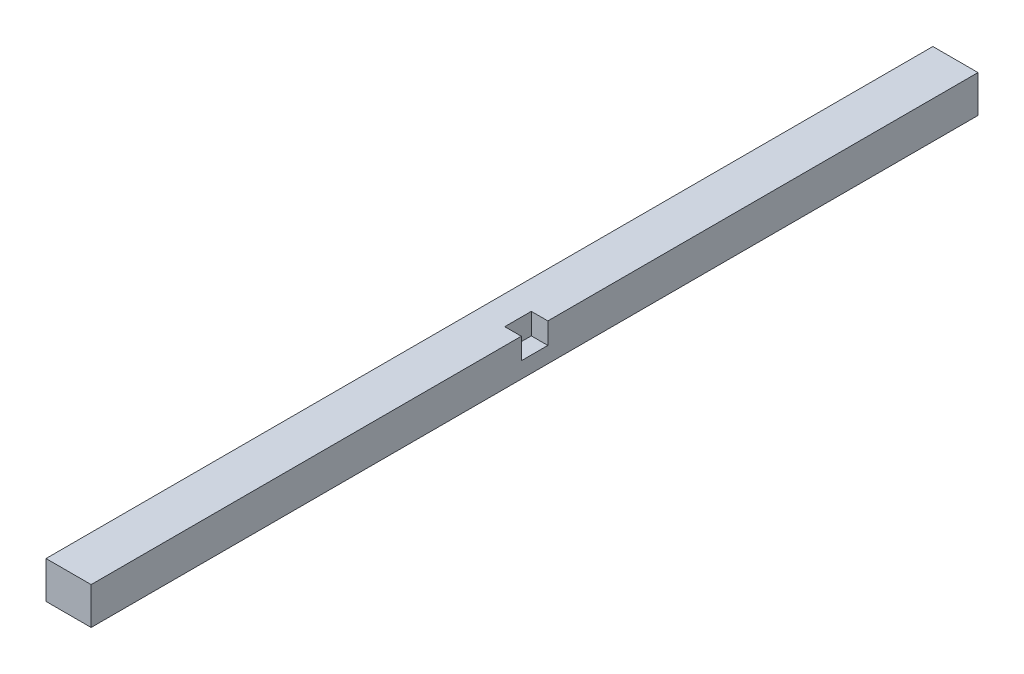
ISO-10303-21;
HEADER;
FILE_DESCRIPTION(('STEP AP214'),'2;1');
FILE_NAME('part.step','',(''),(''),'','','');
FILE_SCHEMA(('AUTOMOTIVE_DESIGN { 1 0 10303 214 1 1 1 1 }'));
ENDSEC;
DATA;
#1=APPLICATION_CONTEXT('core data for automotive mechanical design processes');
#2=APPLICATION_PROTOCOL_DEFINITION('international standard','automotive_design',2000,#1);
#3=PRODUCT_CONTEXT('',#1,'mechanical');
#4=PRODUCT('Part','Part','',(#3));
#5=PRODUCT_RELATED_PRODUCT_CATEGORY('part','',(#4));
#6=PRODUCT_DEFINITION_FORMATION('','',#4);
#7=PRODUCT_DEFINITION_CONTEXT('part definition',#1,'design');
#8=PRODUCT_DEFINITION('design','',#6,#7);
#9=PRODUCT_DEFINITION_SHAPE('','',#8);
#10=(LENGTH_UNIT() NAMED_UNIT(*) SI_UNIT(.MILLI.,.METRE.));
#11=(NAMED_UNIT(*) PLANE_ANGLE_UNIT() SI_UNIT($,.RADIAN.));
#12=(NAMED_UNIT(*) SI_UNIT($,.STERADIAN.) SOLID_ANGLE_UNIT());
#13=UNCERTAINTY_MEASURE_WITH_UNIT(LENGTH_MEASURE(1.E-05),#10,'distance_accuracy_value','');
#14=(GEOMETRIC_REPRESENTATION_CONTEXT(3) GLOBAL_UNCERTAINTY_ASSIGNED_CONTEXT((#13)) GLOBAL_UNIT_ASSIGNED_CONTEXT((#10,
#11,#12)) REPRESENTATION_CONTEXT('',''));
#15=CARTESIAN_POINT('',(0.,0.,0.));
#16=DIRECTION('',(0.,0.,1.));
#17=DIRECTION('',(1.,0.,0.));
#18=AXIS2_PLACEMENT_3D('',#15,#16,#17);
#19=CARTESIAN_POINT('',(-63.5,3.556,0.));
#20=DIRECTION('',(-1.,0.,0.));
#21=DIRECTION('',(0.,0.,1.));
#22=AXIS2_PLACEMENT_3D('',#19,#20,#21);
#23=PLANE('',#22);
#24=DIRECTION('',(0.,0.,-1.));
#25=VECTOR('',#24,1.);
#26=CARTESIAN_POINT('',(-63.5,1.52399999999997,-41.148));
#27=LINE('',#26,#25);
#28=CARTESIAN_POINT('',(-63.5,1.52399999999997,-41.148));
#29=VERTEX_POINT('',#28);
#30=CARTESIAN_POINT('',(-63.5,1.52400000000005,-43.688));
#31=VERTEX_POINT('',#30);
#32=EDGE_CURVE('E131',#29,#31,#27,.T.);
#33=ORIENTED_EDGE('',*,*,#32,.F.);
#34=DIRECTION('',(0.,-1.,0.));
#35=VECTOR('',#34,1.);
#36=CARTESIAN_POINT('',(-63.5,4.06399999999997,-41.148));
#37=LINE('',#36,#35);
#38=CARTESIAN_POINT('',(-63.5,3.556,-41.148));
#39=VERTEX_POINT('',#38);
#40=EDGE_CURVE('E120',#39,#29,#37,.T.);
#41=ORIENTED_EDGE('',*,*,#40,.F.);
#42=DIRECTION('',(0.,0.,-1.));
#43=VECTOR('',#42,1.);
#44=CARTESIAN_POINT('',(-63.5,3.556,0.));
#45=LINE('',#44,#43);
#46=CARTESIAN_POINT('',(-63.5,3.556,0.));
#47=VERTEX_POINT('',#46);
#48=EDGE_CURVE('E136',#47,#39,#45,.T.);
#49=ORIENTED_EDGE('',*,*,#48,.F.);
#50=DIRECTION('',(0.,-1.,0.));
#51=VECTOR('',#50,1.);
#52=CARTESIAN_POINT('',(-63.5,3.556,0.));
#53=LINE('',#52,#51);
#54=CARTESIAN_POINT('',(-63.5,0.,0.));
#55=VERTEX_POINT('',#54);
#56=EDGE_CURVE('E143',#47,#55,#53,.T.);
#57=ORIENTED_EDGE('',*,*,#56,.T.);
#58=DIRECTION('',(0.,0.,-1.));
#59=VECTOR('',#58,1.);
#60=CARTESIAN_POINT('',(-63.5,0.,0.));
#61=LINE('',#60,#59);
#62=CARTESIAN_POINT('',(-63.5,0.,-84.836));
#63=VERTEX_POINT('',#62);
#64=EDGE_CURVE('E134',#55,#63,#61,.T.);
#65=ORIENTED_EDGE('',*,*,#64,.T.);
#66=DIRECTION('',(0.,-1.,0.));
#67=VECTOR('',#66,1.);
#68=CARTESIAN_POINT('',(-63.5,3.556,-84.836));
#69=LINE('',#68,#67);
#70=CARTESIAN_POINT('',(-63.5,3.556,-84.836));
#71=VERTEX_POINT('',#70);
#72=EDGE_CURVE('E157',#71,#63,#69,.T.);
#73=ORIENTED_EDGE('',*,*,#72,.F.);
#74=CARTESIAN_POINT('',(-63.5,3.556,-43.688));
#75=VERTEX_POINT('',#74);
#76=EDGE_CURVE('E84',#75,#71,#45,.T.);
#77=ORIENTED_EDGE('',*,*,#76,.F.);
#78=DIRECTION('',(0.,1.,0.));
#79=VECTOR('',#78,1.);
#80=CARTESIAN_POINT('',(-63.5,1.52400000000005,-43.688));
#81=LINE('',#80,#79);
#82=EDGE_CURVE('E114',#31,#75,#81,.T.);
#83=ORIENTED_EDGE('',*,*,#82,.F.);
#84=EDGE_LOOP('',(#33,#41,#49,#57,#65,#73,#77,#83));
#85=FACE_BOUND('',#84,.T.);
#86=ADVANCED_FACE('F33',(#85),#23,.F.);
#87=CARTESIAN_POINT('',(-63.5,3.556,-84.836));
#88=DIRECTION('',(0.,0.,1.));
#89=DIRECTION('',(1.,0.,0.));
#90=AXIS2_PLACEMENT_3D('',#87,#88,#89);
#91=PLANE('',#90);
#92=DIRECTION('',(-1.,0.,0.));
#93=VECTOR('',#92,1.);
#94=CARTESIAN_POINT('',(-63.5,0.,-84.836));
#95=LINE('',#94,#93);
#96=CARTESIAN_POINT('',(-67.818,0.,-84.836));
#97=VERTEX_POINT('',#96);
#98=EDGE_CURVE('E146',#63,#97,#95,.T.);
#99=ORIENTED_EDGE('',*,*,#98,.T.);
#100=DIRECTION('',(0.,-1.,0.));
#101=VECTOR('',#100,1.);
#102=CARTESIAN_POINT('',(-67.818,3.556,-84.836));
#103=LINE('',#102,#101);
#104=CARTESIAN_POINT('',(-67.818,3.556,-84.836));
#105=VERTEX_POINT('',#104);
#106=EDGE_CURVE('E154',#105,#97,#103,.T.);
#107=ORIENTED_EDGE('',*,*,#106,.F.);
#108=DIRECTION('',(-1.,0.,0.));
#109=VECTOR('',#108,1.);
#110=CARTESIAN_POINT('',(-63.5,3.556,-84.836));
#111=LINE('',#110,#109);
#112=EDGE_CURVE('E138',#71,#105,#111,.T.);
#113=ORIENTED_EDGE('',*,*,#112,.F.);
#114=ORIENTED_EDGE('',*,*,#72,.T.);
#115=EDGE_LOOP('',(#99,#107,#113,#114));
#116=FACE_BOUND('',#115,.T.);
#117=ADVANCED_FACE('F169',(#116),#91,.F.);
#118=CARTESIAN_POINT('',(-67.818,3.556,0.));
#119=DIRECTION('',(1.,0.,0.));
#120=DIRECTION('',(0.,0.,-1.));
#121=AXIS2_PLACEMENT_3D('',#118,#119,#120);
#122=PLANE('',#121);
#123=DIRECTION('',(0.,0.,1.));
#124=VECTOR('',#123,1.);
#125=CARTESIAN_POINT('',(-67.818,0.,0.));
#126=LINE('',#125,#124);
#127=CARTESIAN_POINT('',(-67.818,0.,0.));
#128=VERTEX_POINT('',#127);
#129=EDGE_CURVE('E148',#97,#128,#126,.T.);
#130=ORIENTED_EDGE('',*,*,#129,.T.);
#131=DIRECTION('',(0.,-1.,0.));
#132=VECTOR('',#131,1.);
#133=CARTESIAN_POINT('',(-67.818,3.556,0.));
#134=LINE('',#133,#132);
#135=CARTESIAN_POINT('',(-67.818,3.556,0.));
#136=VERTEX_POINT('',#135);
#137=EDGE_CURVE('E152',#136,#128,#134,.T.);
#138=ORIENTED_EDGE('',*,*,#137,.F.);
#139=DIRECTION('',(0.,0.,1.));
#140=VECTOR('',#139,1.);
#141=CARTESIAN_POINT('',(-67.818,3.556,0.));
#142=LINE('',#141,#140);
#143=EDGE_CURVE('E140',#105,#136,#142,.T.);
#144=ORIENTED_EDGE('',*,*,#143,.F.);
#145=ORIENTED_EDGE('',*,*,#106,.T.);
#146=EDGE_LOOP('',(#130,#138,#144,#145));
#147=FACE_BOUND('',#146,.T.);
#148=ADVANCED_FACE('F174',(#147),#122,.F.);
#149=CARTESIAN_POINT('',(-63.5,3.556,0.));
#150=DIRECTION('',(0.,0.,-1.));
#151=DIRECTION('',(-1.,0.,0.));
#152=AXIS2_PLACEMENT_3D('',#149,#150,#151);
#153=PLANE('',#152);
#154=DIRECTION('',(1.,0.,0.));
#155=VECTOR('',#154,1.);
#156=CARTESIAN_POINT('',(-63.5,0.,0.));
#157=LINE('',#156,#155);
#158=EDGE_CURVE('E77',#128,#55,#157,.T.);
#159=ORIENTED_EDGE('',*,*,#158,.T.);
#160=ORIENTED_EDGE('',*,*,#56,.F.);
#161=DIRECTION('',(1.,0.,0.));
#162=VECTOR('',#161,1.);
#163=CARTESIAN_POINT('',(-63.5,3.556,0.));
#164=LINE('',#163,#162);
#165=EDGE_CURVE('E56',#136,#47,#164,.T.);
#166=ORIENTED_EDGE('',*,*,#165,.F.);
#167=ORIENTED_EDGE('',*,*,#137,.T.);
#168=EDGE_LOOP('',(#159,#160,#166,#167));
#169=FACE_BOUND('',#168,.T.);
#170=ADVANCED_FACE('F176',(#169),#153,.F.);
#171=CARTESIAN_POINT('',(0.,3.556,0.));
#172=DIRECTION('',(0.,1.,0.));
#173=DIRECTION('',(0.,0.,1.));
#174=AXIS2_PLACEMENT_3D('',#171,#172,#173);
#175=PLANE('',#174);
#176=DIRECTION('',(1.,0.,0.));
#177=VECTOR('',#176,1.);
#178=CARTESIAN_POINT('',(0.,3.556,-41.148));
#179=LINE('',#178,#177);
#180=CARTESIAN_POINT('',(-65.0832727694083,3.556,-41.148));
#181=VERTEX_POINT('',#180);
#182=EDGE_CURVE('E11',#181,#39,#179,.T.);
#183=ORIENTED_EDGE('',*,*,#182,.F.);
#184=DIRECTION('',(0.,0.,-1.));
#185=VECTOR('',#184,1.);
#186=CARTESIAN_POINT('',(-65.0832727694083,3.556,0.));
#187=LINE('',#186,#185);
#188=CARTESIAN_POINT('',(-65.0832727694083,3.556,-43.688));
#189=VERTEX_POINT('',#188);
#190=EDGE_CURVE('E111',#181,#189,#187,.T.);
#191=ORIENTED_EDGE('',*,*,#190,.T.);
#192=DIRECTION('',(-1.,0.,0.));
#193=VECTOR('',#192,1.);
#194=CARTESIAN_POINT('',(0.,3.556,-43.688));
#195=LINE('',#194,#193);
#196=EDGE_CURVE('E40',#75,#189,#195,.T.);
#197=ORIENTED_EDGE('',*,*,#196,.F.);
#198=ORIENTED_EDGE('',*,*,#76,.T.);
#199=ORIENTED_EDGE('',*,*,#112,.T.);
#200=ORIENTED_EDGE('',*,*,#143,.T.);
#201=ORIENTED_EDGE('',*,*,#165,.T.);
#202=ORIENTED_EDGE('',*,*,#48,.T.);
#203=EDGE_LOOP('',(#183,#191,#197,#198,#199,#200,#201,#202));
#204=FACE_BOUND('',#203,.T.);
#205=ADVANCED_FACE('F163',(#204),#175,.T.);
#206=CARTESIAN_POINT('',(0.,0.,0.));
#207=DIRECTION('',(0.,1.,0.));
#208=DIRECTION('',(0.,0.,1.));
#209=AXIS2_PLACEMENT_3D('',#206,#207,#208);
#210=PLANE('',#209);
#211=ORIENTED_EDGE('',*,*,#64,.F.);
#212=ORIENTED_EDGE('',*,*,#158,.F.);
#213=ORIENTED_EDGE('',*,*,#129,.F.);
#214=ORIENTED_EDGE('',*,*,#98,.F.);
#215=EDGE_LOOP('',(#211,#212,#213,#214));
#216=FACE_BOUND('',#215,.T.);
#217=ADVANCED_FACE('F178',(#216),#210,.F.);
#218=CARTESIAN_POINT('',(-65.0832727694083,4.06399999999997,-41.148));
#219=DIRECTION('',(0.,0.,1.));
#220=DIRECTION('',(0.,-1.,0.));
#221=AXIS2_PLACEMENT_3D('',#218,#219,#220);
#222=PLANE('',#221);
#223=ORIENTED_EDGE('',*,*,#182,.T.);
#224=ORIENTED_EDGE('',*,*,#40,.T.);
#225=DIRECTION('',(1.,0.,0.));
#226=VECTOR('',#225,1.);
#227=CARTESIAN_POINT('',(-65.0832727694083,1.52399999999997,-41.148));
#228=LINE('',#227,#226);
#229=CARTESIAN_POINT('',(-65.0832727694083,1.52399999999997,-41.148));
#230=VERTEX_POINT('',#229);
#231=EDGE_CURVE('E117',#230,#29,#228,.T.);
#232=ORIENTED_EDGE('',*,*,#231,.F.);
#233=DIRECTION('',(0.,-1.,0.));
#234=VECTOR('',#233,1.);
#235=CARTESIAN_POINT('',(-65.0832727694083,4.06399999999997,-41.148));
#236=LINE('',#235,#234);
#237=EDGE_CURVE('E105',#181,#230,#236,.T.);
#238=ORIENTED_EDGE('',*,*,#237,.F.);
#239=EDGE_LOOP('',(#223,#224,#232,#238));
#240=FACE_BOUND('',#239,.T.);
#241=ADVANCED_FACE('F118',(#240),#222,.F.);
#242=CARTESIAN_POINT('',(-65.0832727694083,1.52400000000005,-43.688));
#243=DIRECTION('',(0.,0.,-1.));
#244=DIRECTION('',(0.,1.,0.));
#245=AXIS2_PLACEMENT_3D('',#242,#243,#244);
#246=PLANE('',#245);
#247=ORIENTED_EDGE('',*,*,#196,.T.);
#248=DIRECTION('',(0.,1.,0.));
#249=VECTOR('',#248,1.);
#250=CARTESIAN_POINT('',(-65.0832727694083,1.52400000000005,-43.688));
#251=LINE('',#250,#249);
#252=CARTESIAN_POINT('',(-65.0832727694083,1.52400000000005,-43.688));
#253=VERTEX_POINT('',#252);
#254=EDGE_CURVE('E47',#253,#189,#251,.T.);
#255=ORIENTED_EDGE('',*,*,#254,.F.);
#256=DIRECTION('',(1.,0.,0.));
#257=VECTOR('',#256,1.);
#258=CARTESIAN_POINT('',(-65.0832727694083,1.52400000000005,-43.688));
#259=LINE('',#258,#257);
#260=EDGE_CURVE('E124',#253,#31,#259,.T.);
#261=ORIENTED_EDGE('',*,*,#260,.T.);
#262=ORIENTED_EDGE('',*,*,#82,.T.);
#263=EDGE_LOOP('',(#247,#255,#261,#262));
#264=FACE_BOUND('',#263,.T.);
#265=ADVANCED_FACE('F161',(#264),#246,.F.);
#266=CARTESIAN_POINT('',(-65.0832727694083,1.52399999999997,-41.148));
#267=DIRECTION('',(0.,-1.,0.));
#268=DIRECTION('',(0.,0.,-1.));
#269=AXIS2_PLACEMENT_3D('',#266,#267,#268);
#270=PLANE('',#269);
#271=ORIENTED_EDGE('',*,*,#32,.T.);
#272=ORIENTED_EDGE('',*,*,#260,.F.);
#273=DIRECTION('',(0.,0.,-1.));
#274=VECTOR('',#273,1.);
#275=CARTESIAN_POINT('',(-65.0832727694083,1.52399999999997,-41.148));
#276=LINE('',#275,#274);
#277=EDGE_CURVE('E109',#230,#253,#276,.T.);
#278=ORIENTED_EDGE('',*,*,#277,.F.);
#279=ORIENTED_EDGE('',*,*,#231,.T.);
#280=EDGE_LOOP('',(#271,#272,#278,#279));
#281=FACE_BOUND('',#280,.T.);
#282=ADVANCED_FACE('F126',(#281),#270,.F.);
#283=CARTESIAN_POINT('',(-65.0832727694083,0.,0.));
#284=DIRECTION('',(1.,0.,0.));
#285=DIRECTION('',(0.,0.,-1.));
#286=AXIS2_PLACEMENT_3D('',#283,#284,#285);
#287=PLANE('',#286);
#288=ORIENTED_EDGE('',*,*,#237,.T.);
#289=ORIENTED_EDGE('',*,*,#277,.T.);
#290=ORIENTED_EDGE('',*,*,#254,.T.);
#291=ORIENTED_EDGE('',*,*,#190,.F.);
#292=EDGE_LOOP('',(#288,#289,#290,#291));
#293=FACE_BOUND('',#292,.T.);
#294=ADVANCED_FACE('F107',(#293),#287,.T.);
#295=CLOSED_SHELL('',(#86,#117,#148,#170,#205,#217,#241,#265,#282,#294));
#296=MANIFOLD_SOLID_BREP('B2',#295);
#297=ADVANCED_BREP_SHAPE_REPRESENTATION('',(#18,#296),#14);
#298=SHAPE_DEFINITION_REPRESENTATION(#9,#297);
ENDSEC;
END-ISO-10303-21;
